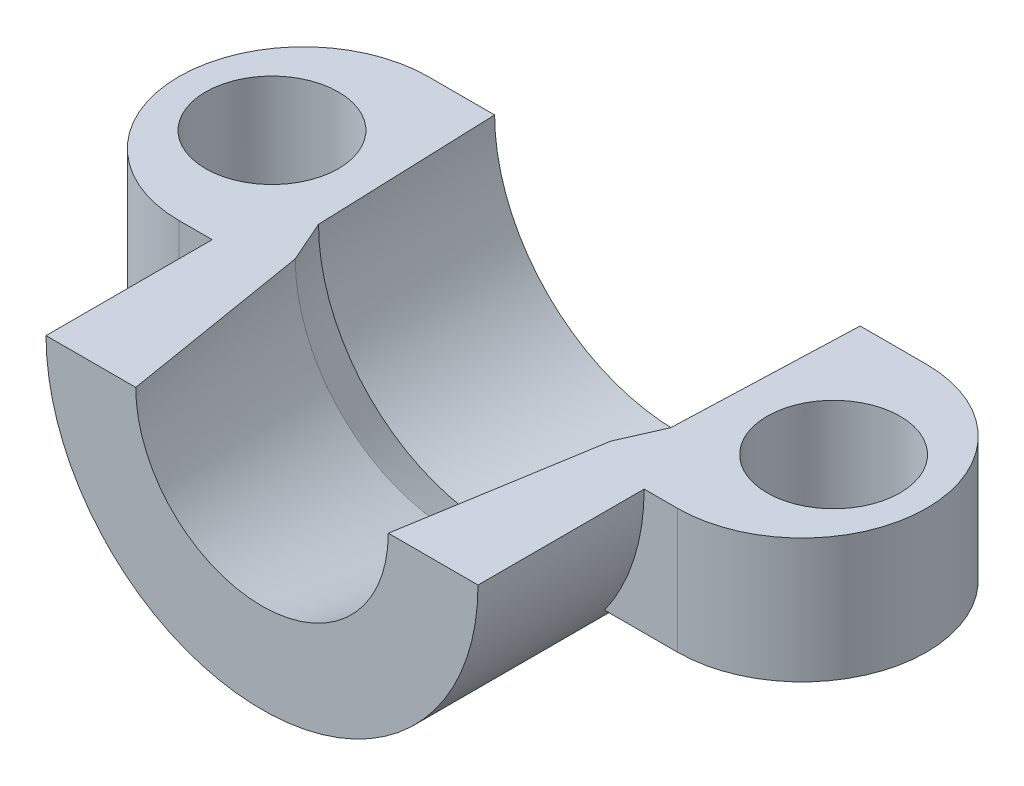
ISO-10303-21;
HEADER;
FILE_DESCRIPTION(('STEP AP214'),'2;1');
FILE_NAME('part.step','',(''),(''),'','','');
FILE_SCHEMA(('AUTOMOTIVE_DESIGN { 1 0 10303 214 1 1 1 1 }'));
ENDSEC;
DATA;
#1=APPLICATION_CONTEXT('core data for automotive mechanical design processes');
#2=APPLICATION_PROTOCOL_DEFINITION('international standard','automotive_design',2000,#1);
#3=PRODUCT_CONTEXT('',#1,'mechanical');
#4=PRODUCT('Part','Part','',(#3));
#5=PRODUCT_RELATED_PRODUCT_CATEGORY('part','',(#4));
#6=PRODUCT_DEFINITION_FORMATION('','',#4);
#7=PRODUCT_DEFINITION_CONTEXT('part definition',#1,'design');
#8=PRODUCT_DEFINITION('design','',#6,#7);
#9=PRODUCT_DEFINITION_SHAPE('','',#8);
#10=(LENGTH_UNIT() NAMED_UNIT(*) SI_UNIT(.MILLI.,.METRE.));
#11=(NAMED_UNIT(*) PLANE_ANGLE_UNIT() SI_UNIT($,.RADIAN.));
#12=(NAMED_UNIT(*) SI_UNIT($,.STERADIAN.) SOLID_ANGLE_UNIT());
#13=UNCERTAINTY_MEASURE_WITH_UNIT(LENGTH_MEASURE(1.E-05),#10,'distance_accuracy_value','');
#14=(GEOMETRIC_REPRESENTATION_CONTEXT(3) GLOBAL_UNCERTAINTY_ASSIGNED_CONTEXT((#13)) GLOBAL_UNIT_ASSIGNED_CONTEXT((#10,
#11,#12)) REPRESENTATION_CONTEXT('',''));
#15=CARTESIAN_POINT('',(0.,0.,0.));
#16=DIRECTION('',(0.,0.,1.));
#17=DIRECTION('',(1.,0.,0.));
#18=AXIS2_PLACEMENT_3D('',#15,#16,#17);
#19=CARTESIAN_POINT('',(0.,0.,-25.));
#20=DIRECTION('',(0.,0.,1.));
#21=DIRECTION('',(1.,0.,0.));
#22=AXIS2_PLACEMENT_3D('',#19,#20,#21);
#23=CYLINDRICAL_SURFACE('',#22,13.);
#24=CARTESIAN_POINT('',(0.,0.,0.));
#25=DIRECTION('',(0.,0.,1.));
#26=DIRECTION('',(1.,0.,0.));
#27=AXIS2_PLACEMENT_3D('',#24,#25,#26);
#28=CIRCLE('',#27,13.);
#29=CARTESIAN_POINT('',(-13.,0.,0.));
#30=VERTEX_POINT('',#29);
#31=CARTESIAN_POINT('',(13.,0.,0.));
#32=VERTEX_POINT('',#31);
#33=EDGE_CURVE('E181',#30,#32,#28,.T.);
#34=ORIENTED_EDGE('',*,*,#33,.F.);
#35=DIRECTION('',(0.,0.,1.));
#36=VECTOR('',#35,1.);
#37=CARTESIAN_POINT('',(-13.,0.,-25.));
#38=LINE('',#37,#36);
#39=CARTESIAN_POINT('',(-13.,0.,-10.));
#40=VERTEX_POINT('',#39);
#41=EDGE_CURVE('E230',#30,#40,#38,.F.);
#42=ORIENTED_EDGE('',*,*,#41,.T.);
#43=CARTESIAN_POINT('',(0.,0.,-10.));
#44=DIRECTION('',(0.,0.,-1.));
#45=DIRECTION('',(-1.,0.,0.));
#46=AXIS2_PLACEMENT_3D('',#43,#44,#45);
#47=CIRCLE('',#46,13.);
#48=CARTESIAN_POINT('',(-10.6183802907976,-7.5,-10.));
#49=VERTEX_POINT('',#48);
#50=EDGE_CURVE('E11',#40,#49,#47,.F.);
#51=ORIENTED_EDGE('',*,*,#50,.T.);
#52=DIRECTION('',(0.,0.,1.));
#53=VECTOR('',#52,1.);
#54=CARTESIAN_POINT('',(-10.6183802907976,-7.5,-25.));
#55=LINE('',#54,#53);
#56=CARTESIAN_POINT('',(-10.6183802907976,-7.5,-25.));
#57=VERTEX_POINT('',#56);
#58=EDGE_CURVE('E148',#57,#49,#55,.T.);
#59=ORIENTED_EDGE('',*,*,#58,.F.);
#60=CARTESIAN_POINT('',(0.,0.,-25.));
#61=DIRECTION('',(0.,0.,1.));
#62=DIRECTION('',(1.,0.,0.));
#63=AXIS2_PLACEMENT_3D('',#60,#61,#62);
#64=CIRCLE('',#63,13.);
#65=CARTESIAN_POINT('',(10.6183802907976,-7.5,-25.));
#66=VERTEX_POINT('',#65);
#67=EDGE_CURVE('E182',#57,#66,#64,.T.);
#68=ORIENTED_EDGE('',*,*,#67,.T.);
#69=DIRECTION('',(0.,0.,1.));
#70=VECTOR('',#69,1.);
#71=CARTESIAN_POINT('',(10.6183802907976,-7.5,-25.));
#72=LINE('',#71,#70);
#73=CARTESIAN_POINT('',(10.6183802907976,-7.5,-10.));
#74=VERTEX_POINT('',#73);
#75=EDGE_CURVE('E164',#74,#66,#72,.F.);
#76=ORIENTED_EDGE('',*,*,#75,.F.);
#77=CARTESIAN_POINT('',(0.,0.,-10.));
#78=DIRECTION('',(0.,0.,-1.));
#79=DIRECTION('',(-1.,0.,0.));
#80=AXIS2_PLACEMENT_3D('',#77,#78,#79);
#81=CIRCLE('',#80,13.);
#82=CARTESIAN_POINT('',(13.,0.,-10.));
#83=VERTEX_POINT('',#82);
#84=EDGE_CURVE('E39',#74,#83,#81,.F.);
#85=ORIENTED_EDGE('',*,*,#84,.T.);
#86=DIRECTION('',(0.,0.,1.));
#87=VECTOR('',#86,1.);
#88=CARTESIAN_POINT('',(13.,0.,-25.));
#89=LINE('',#88,#87);
#90=EDGE_CURVE('E190',#83,#32,#89,.T.);
#91=ORIENTED_EDGE('',*,*,#90,.T.);
#92=EDGE_LOOP('',(#34,#42,#51,#59,#68,#76,#85,#91));
#93=FACE_BOUND('',#92,.T.);
#94=ADVANCED_FACE('F32',(#93),#23,.T.);
#95=CARTESIAN_POINT('',(0.,0.,-25.));
#96=DIRECTION('',(0.,0.,1.));
#97=DIRECTION('',(1.,0.,0.));
#98=AXIS2_PLACEMENT_3D('',#95,#96,#97);
#99=PLANE('',#98);
#100=DIRECTION('',(-1.,0.,0.));
#101=VECTOR('',#100,1.);
#102=CARTESIAN_POINT('',(0.,0.,-25.));
#103=LINE('',#102,#101);
#104=CARTESIAN_POINT('',(15.,0.,-25.));
#105=VERTEX_POINT('',#104);
#106=CARTESIAN_POINT('',(11.,0.,-25.));
#107=VERTEX_POINT('',#106);
#108=EDGE_CURVE('E196',#105,#107,#103,.T.);
#109=ORIENTED_EDGE('',*,*,#108,.F.);
#110=DIRECTION('',(0.,-1.,0.));
#111=VECTOR('',#110,1.);
#112=CARTESIAN_POINT('',(15.,7.5,-25.));
#113=LINE('',#112,#111);
#114=CARTESIAN_POINT('',(15.,-7.5,-25.));
#115=VERTEX_POINT('',#114);
#116=EDGE_CURVE('E158',#105,#115,#113,.T.);
#117=ORIENTED_EDGE('',*,*,#116,.T.);
#118=DIRECTION('',(-1.,0.,0.));
#119=VECTOR('',#118,1.);
#120=CARTESIAN_POINT('',(13.,-7.5,-25.));
#121=LINE('',#120,#119);
#122=EDGE_CURVE('E160',#115,#66,#121,.T.);
#123=ORIENTED_EDGE('',*,*,#122,.T.);
#124=ORIENTED_EDGE('',*,*,#67,.F.);
#125=DIRECTION('',(-1.,0.,0.));
#126=VECTOR('',#125,1.);
#127=CARTESIAN_POINT('',(-13.,-7.5,-25.));
#128=LINE('',#127,#126);
#129=CARTESIAN_POINT('',(-15.,-7.5,-25.));
#130=VERTEX_POINT('',#129);
#131=EDGE_CURVE('E140',#57,#130,#128,.T.);
#132=ORIENTED_EDGE('',*,*,#131,.T.);
#133=DIRECTION('',(0.,-1.,0.));
#134=VECTOR('',#133,1.);
#135=CARTESIAN_POINT('',(-15.,7.5,-25.));
#136=LINE('',#135,#134);
#137=CARTESIAN_POINT('',(-15.,0.,-25.));
#138=VERTEX_POINT('',#137);
#139=EDGE_CURVE('E138',#138,#130,#136,.T.);
#140=ORIENTED_EDGE('',*,*,#139,.F.);
#141=CARTESIAN_POINT('',(-11.,0.,-25.));
#142=VERTEX_POINT('',#141);
#143=EDGE_CURVE('E54',#142,#138,#103,.T.);
#144=ORIENTED_EDGE('',*,*,#143,.F.);
#145=CARTESIAN_POINT('',(0.,0.,-25.));
#146=DIRECTION('',(0.,0.,-1.));
#147=DIRECTION('',(-1.,0.,0.));
#148=AXIS2_PLACEMENT_3D('',#145,#146,#147);
#149=CIRCLE('',#148,11.);
#150=EDGE_CURVE('E169',#107,#142,#149,.T.);
#151=ORIENTED_EDGE('',*,*,#150,.F.);
#152=EDGE_LOOP('',(#109,#117,#123,#124,#132,#140,#144,#151));
#153=FACE_BOUND('',#152,.T.);
#154=ADVANCED_FACE('F254',(#153),#99,.F.);
#155=CARTESIAN_POINT('',(0.,0.,0.));
#156=DIRECTION('',(0.,0.,1.));
#157=DIRECTION('',(1.,0.,0.));
#158=AXIS2_PLACEMENT_3D('',#155,#156,#157);
#159=PLANE('',#158);
#160=ORIENTED_EDGE('',*,*,#33,.T.);
#161=DIRECTION('',(-1.,0.,0.));
#162=VECTOR('',#161,1.);
#163=CARTESIAN_POINT('',(0.,0.,0.));
#164=LINE('',#163,#162);
#165=CARTESIAN_POINT('',(7.6,0.,0.));
#166=VERTEX_POINT('',#165);
#167=EDGE_CURVE('E211',#32,#166,#164,.T.);
#168=ORIENTED_EDGE('',*,*,#167,.T.);
#169=CARTESIAN_POINT('',(0.,0.,0.));
#170=DIRECTION('',(0.,0.,-1.));
#171=DIRECTION('',(-1.,0.,0.));
#172=AXIS2_PLACEMENT_3D('',#169,#170,#171);
#173=CIRCLE('',#172,7.6);
#174=CARTESIAN_POINT('',(-7.6,0.,0.));
#175=VERTEX_POINT('',#174);
#176=EDGE_CURVE('E178',#166,#175,#173,.T.);
#177=ORIENTED_EDGE('',*,*,#176,.T.);
#178=EDGE_CURVE('E200',#175,#30,#164,.T.);
#179=ORIENTED_EDGE('',*,*,#178,.T.);
#180=EDGE_LOOP('',(#160,#168,#177,#179));
#181=FACE_BOUND('',#180,.T.);
#182=ADVANCED_FACE('F258',(#181),#159,.T.);
#183=CARTESIAN_POINT('',(0.,0.,-11.5));
#184=DIRECTION('',(0.,0.,-1.));
#185=DIRECTION('',(-1.,0.,0.));
#186=AXIS2_PLACEMENT_3D('',#183,#184,#185);
#187=CONICAL_SURFACE('',#186,9.5,0.163738241114359);
#188=DIRECTION('',(0.163007578448158,0.,-0.986624816923063));
#189=VECTOR('',#188,1.);
#190=CARTESIAN_POINT('',(0.,0.,46.0000000000001));
#191=LINE('',#190,#189);
#192=CARTESIAN_POINT('',(9.5,0.,-11.5));
#193=VERTEX_POINT('',#192);
#194=EDGE_CURVE('E209',#193,#166,#191,.F.);
#195=ORIENTED_EDGE('',*,*,#194,.F.);
#196=CARTESIAN_POINT('',(0.,0.,-11.5));
#197=DIRECTION('',(0.,0.,-1.));
#198=DIRECTION('',(-1.,0.,0.));
#199=AXIS2_PLACEMENT_3D('',#196,#197,#198);
#200=CIRCLE('',#199,9.5);
#201=CARTESIAN_POINT('',(-9.5,0.,-11.5));
#202=VERTEX_POINT('',#201);
#203=EDGE_CURVE('E175',#193,#202,#200,.T.);
#204=ORIENTED_EDGE('',*,*,#203,.T.);
#205=DIRECTION('',(0.163007578448158,0.,0.986624816923063));
#206=VECTOR('',#205,1.);
#207=CARTESIAN_POINT('',(0.,0.,46.0000000000001));
#208=LINE('',#207,#206);
#209=EDGE_CURVE('E222',#175,#202,#208,.F.);
#210=ORIENTED_EDGE('',*,*,#209,.F.);
#211=ORIENTED_EDGE('',*,*,#176,.F.);
#212=EDGE_LOOP('',(#195,#204,#210,#211));
#213=FACE_BOUND('',#212,.T.);
#214=ADVANCED_FACE('F264',(#213),#187,.F.);
#215=CARTESIAN_POINT('',(0.,0.,-14.));
#216=DIRECTION('',(0.,0.,-1.));
#217=DIRECTION('',(-1.,0.,0.));
#218=AXIS2_PLACEMENT_3D('',#215,#216,#217);
#219=CONICAL_SURFACE('',#218,10.6,0.414506874584786);
#220=DIRECTION('',(0.402738614266017,0.,-0.915315032422766));
#221=VECTOR('',#220,1.);
#222=CARTESIAN_POINT('',(0.,0.,10.0909090909091));
#223=LINE('',#222,#221);
#224=CARTESIAN_POINT('',(10.6,0.,-14.));
#225=VERTEX_POINT('',#224);
#226=EDGE_CURVE('E207',#225,#193,#223,.F.);
#227=ORIENTED_EDGE('',*,*,#226,.F.);
#228=CARTESIAN_POINT('',(0.,0.,-14.));
#229=DIRECTION('',(0.,0.,-1.));
#230=DIRECTION('',(-1.,0.,0.));
#231=AXIS2_PLACEMENT_3D('',#228,#229,#230);
#232=CIRCLE('',#231,10.6);
#233=CARTESIAN_POINT('',(-10.6,0.,-14.));
#234=VERTEX_POINT('',#233);
#235=EDGE_CURVE('E172',#225,#234,#232,.T.);
#236=ORIENTED_EDGE('',*,*,#235,.T.);
#237=DIRECTION('',(0.402738614266017,0.,0.915315032422766));
#238=VECTOR('',#237,1.);
#239=CARTESIAN_POINT('',(0.,0.,10.0909090909091));
#240=LINE('',#239,#238);
#241=EDGE_CURVE('E223',#202,#234,#240,.F.);
#242=ORIENTED_EDGE('',*,*,#241,.F.);
#243=ORIENTED_EDGE('',*,*,#203,.F.);
#244=EDGE_LOOP('',(#227,#236,#242,#243));
#245=FACE_BOUND('',#244,.T.);
#246=ADVANCED_FACE('F269',(#245),#219,.F.);
#247=CARTESIAN_POINT('',(0.,0.,-25.));
#248=DIRECTION('',(0.,0.,-1.));
#249=DIRECTION('',(-1.,0.,0.));
#250=AXIS2_PLACEMENT_3D('',#247,#248,#249);
#251=CONICAL_SURFACE('',#250,11.,0.0363476210190208);
#252=DIRECTION('',(0.0363396181071431,0.,-0.999339497946432));
#253=VECTOR('',#252,1.);
#254=CARTESIAN_POINT('',(0.,0.,277.499999999999));
#255=LINE('',#254,#253);
#256=EDGE_CURVE('E205',#107,#225,#255,.F.);
#257=ORIENTED_EDGE('',*,*,#256,.F.);
#258=ORIENTED_EDGE('',*,*,#150,.T.);
#259=DIRECTION('',(0.0363396181071431,0.,0.999339497946432));
#260=VECTOR('',#259,1.);
#261=CARTESIAN_POINT('',(0.,0.,277.499999999999));
#262=LINE('',#261,#260);
#263=EDGE_CURVE('E226',#234,#142,#262,.F.);
#264=ORIENTED_EDGE('',*,*,#263,.F.);
#265=ORIENTED_EDGE('',*,*,#235,.F.);
#266=EDGE_LOOP('',(#257,#258,#264,#265));
#267=FACE_BOUND('',#266,.T.);
#268=ADVANCED_FACE('F273',(#267),#251,.F.);
#269=CARTESIAN_POINT('',(0.,0.,-10.));
#270=DIRECTION('',(0.,0.,-1.));
#271=DIRECTION('',(-1.,0.,0.));
#272=AXIS2_PLACEMENT_3D('',#269,#270,#271);
#273=PLANE('',#272);
#274=DIRECTION('',(1.,0.,0.));
#275=VECTOR('',#274,1.);
#276=CARTESIAN_POINT('',(0.,0.,-10.));
#277=LINE('',#276,#275);
#278=CARTESIAN_POINT('',(15.,0.,-10.));
#279=VERTEX_POINT('',#278);
#280=EDGE_CURVE('E46',#83,#279,#277,.T.);
#281=ORIENTED_EDGE('',*,*,#280,.F.);
#282=ORIENTED_EDGE('',*,*,#84,.F.);
#283=DIRECTION('',(-1.,0.,0.));
#284=VECTOR('',#283,1.);
#285=CARTESIAN_POINT('',(13.,-7.5,-10.));
#286=LINE('',#285,#284);
#287=CARTESIAN_POINT('',(15.,-7.5,-10.));
#288=VERTEX_POINT('',#287);
#289=EDGE_CURVE('E161',#288,#74,#286,.T.);
#290=ORIENTED_EDGE('',*,*,#289,.F.);
#291=DIRECTION('',(0.,-1.,0.));
#292=VECTOR('',#291,1.);
#293=CARTESIAN_POINT('',(15.,7.5,-10.));
#294=LINE('',#293,#292);
#295=EDGE_CURVE('E156',#279,#288,#294,.T.);
#296=ORIENTED_EDGE('',*,*,#295,.F.);
#297=EDGE_LOOP('',(#281,#282,#290,#296));
#298=FACE_BOUND('',#297,.T.);
#299=ADVANCED_FACE('F193',(#298),#273,.F.);
#300=CARTESIAN_POINT('',(15.,7.5,-17.5));
#301=DIRECTION('',(0.,-1.,0.));
#302=DIRECTION('',(0.,0.,-1.));
#303=AXIS2_PLACEMENT_3D('',#300,#301,#302);
#304=CYLINDRICAL_SURFACE('',#303,7.5);
#305=CARTESIAN_POINT('',(15.,0.,-17.5));
#306=DIRECTION('',(0.,1.,0.));
#307=DIRECTION('',(0.,0.,1.));
#308=AXIS2_PLACEMENT_3D('',#305,#306,#307);
#309=CIRCLE('',#308,7.5);
#310=EDGE_CURVE('E197',#279,#105,#309,.T.);
#311=ORIENTED_EDGE('',*,*,#310,.F.);
#312=ORIENTED_EDGE('',*,*,#295,.T.);
#313=CARTESIAN_POINT('',(15.,-7.5,-17.5));
#314=DIRECTION('',(0.,1.,0.));
#315=DIRECTION('',(0.,0.,1.));
#316=AXIS2_PLACEMENT_3D('',#313,#314,#315);
#317=CIRCLE('',#316,7.5);
#318=EDGE_CURVE('E153',#288,#115,#317,.T.);
#319=ORIENTED_EDGE('',*,*,#318,.T.);
#320=ORIENTED_EDGE('',*,*,#116,.F.);
#321=EDGE_LOOP('',(#311,#312,#319,#320));
#322=FACE_BOUND('',#321,.T.);
#323=ADVANCED_FACE('F284',(#322),#304,.T.);
#324=CARTESIAN_POINT('',(0.,0.,-10.));
#325=DIRECTION('',(0.,0.,-1.));
#326=DIRECTION('',(-1.,0.,0.));
#327=AXIS2_PLACEMENT_3D('',#324,#325,#326);
#328=PLANE('',#327);
#329=DIRECTION('',(1.,0.,0.));
#330=VECTOR('',#329,1.);
#331=CARTESIAN_POINT('',(0.,0.,-10.));
#332=LINE('',#331,#330);
#333=CARTESIAN_POINT('',(-15.,0.,-10.));
#334=VERTEX_POINT('',#333);
#335=EDGE_CURVE('E120',#334,#40,#332,.T.);
#336=ORIENTED_EDGE('',*,*,#335,.F.);
#337=DIRECTION('',(0.,-1.,0.));
#338=VECTOR('',#337,1.);
#339=CARTESIAN_POINT('',(-15.,7.5,-10.));
#340=LINE('',#339,#338);
#341=CARTESIAN_POINT('',(-15.,-7.5,-10.));
#342=VERTEX_POINT('',#341);
#343=EDGE_CURVE('E131',#334,#342,#340,.T.);
#344=ORIENTED_EDGE('',*,*,#343,.T.);
#345=DIRECTION('',(-1.,0.,0.));
#346=VECTOR('',#345,1.);
#347=CARTESIAN_POINT('',(-13.,-7.5,-10.));
#348=LINE('',#347,#346);
#349=EDGE_CURVE('E146',#49,#342,#348,.T.);
#350=ORIENTED_EDGE('',*,*,#349,.F.);
#351=ORIENTED_EDGE('',*,*,#50,.F.);
#352=EDGE_LOOP('',(#336,#344,#350,#351));
#353=FACE_BOUND('',#352,.T.);
#354=ADVANCED_FACE('F129',(#353),#328,.F.);
#355=CARTESIAN_POINT('',(-15.,7.5,-17.5));
#356=DIRECTION('',(0.,-1.,0.));
#357=DIRECTION('',(0.,0.,-1.));
#358=AXIS2_PLACEMENT_3D('',#355,#356,#357);
#359=CYLINDRICAL_SURFACE('',#358,7.5);
#360=CARTESIAN_POINT('',(-15.,0.,-17.5));
#361=DIRECTION('',(0.,1.,0.));
#362=DIRECTION('',(0.,0.,1.));
#363=AXIS2_PLACEMENT_3D('',#360,#361,#362);
#364=CIRCLE('',#363,7.5);
#365=EDGE_CURVE('E116',#138,#334,#364,.T.);
#366=ORIENTED_EDGE('',*,*,#365,.F.);
#367=ORIENTED_EDGE('',*,*,#139,.T.);
#368=CARTESIAN_POINT('',(-15.,-7.5,-17.5));
#369=DIRECTION('',(0.,1.,0.));
#370=DIRECTION('',(0.,0.,-1.));
#371=AXIS2_PLACEMENT_3D('',#368,#369,#370);
#372=CIRCLE('',#371,7.5);
#373=EDGE_CURVE('E137',#130,#342,#372,.T.);
#374=ORIENTED_EDGE('',*,*,#373,.T.);
#375=ORIENTED_EDGE('',*,*,#343,.F.);
#376=EDGE_LOOP('',(#366,#367,#374,#375));
#377=FACE_BOUND('',#376,.T.);
#378=ADVANCED_FACE('F135',(#377),#359,.T.);
#379=CARTESIAN_POINT('',(13.,-7.5,-10.));
#380=DIRECTION('',(0.,-1.,0.));
#381=DIRECTION('',(0.,0.,-1.));
#382=AXIS2_PLACEMENT_3D('',#379,#380,#381);
#383=PLANE('',#382);
#384=CARTESIAN_POINT('',(16.9,-7.5,-17.5));
#385=DIRECTION('',(0.,-1.,0.));
#386=DIRECTION('',(0.,0.,-1.));
#387=AXIS2_PLACEMENT_3D('',#384,#385,#386);
#388=CIRCLE('',#387,4.);
#389=CARTESIAN_POINT('',(16.9,-7.5,-21.5));
#390=VERTEX_POINT('',#389);
#391=EDGE_CURVE('E213',#390,#390,#388,.T.);
#392=ORIENTED_EDGE('',*,*,#391,.F.);
#393=EDGE_LOOP('',(#392));
#394=FACE_BOUND('',#393,.T.);
#395=ORIENTED_EDGE('',*,*,#289,.T.);
#396=ORIENTED_EDGE('',*,*,#75,.T.);
#397=ORIENTED_EDGE('',*,*,#122,.F.);
#398=ORIENTED_EDGE('',*,*,#318,.F.);
#399=EDGE_LOOP('',(#395,#396,#397,#398));
#400=FACE_BOUND('',#399,.T.);
#401=ADVANCED_FACE('F278',(#394,#400),#383,.T.);
#402=CARTESIAN_POINT('',(-13.,-7.5,-10.));
#403=DIRECTION('',(0.,-1.,0.));
#404=DIRECTION('',(0.,0.,-1.));
#405=AXIS2_PLACEMENT_3D('',#402,#403,#404);
#406=PLANE('',#405);
#407=CARTESIAN_POINT('',(-16.9,-7.5,-17.5));
#408=DIRECTION('',(0.,-1.,0.));
#409=DIRECTION('',(0.,0.,-1.));
#410=AXIS2_PLACEMENT_3D('',#407,#408,#409);
#411=CIRCLE('',#410,4.);
#412=CARTESIAN_POINT('',(-16.9,-7.5,-21.5));
#413=VERTEX_POINT('',#412);
#414=EDGE_CURVE('E142',#413,#413,#411,.T.);
#415=ORIENTED_EDGE('',*,*,#414,.F.);
#416=EDGE_LOOP('',(#415));
#417=FACE_BOUND('',#416,.T.);
#418=ORIENTED_EDGE('',*,*,#131,.F.);
#419=ORIENTED_EDGE('',*,*,#58,.T.);
#420=ORIENTED_EDGE('',*,*,#349,.T.);
#421=ORIENTED_EDGE('',*,*,#373,.F.);
#422=EDGE_LOOP('',(#418,#419,#420,#421));
#423=FACE_BOUND('',#422,.T.);
#424=ADVANCED_FACE('F249',(#417,#423),#406,.T.);
#425=CARTESIAN_POINT('',(-16.9,0.,-17.5));
#426=DIRECTION('',(0.,-1.,0.));
#427=DIRECTION('',(0.,0.,-1.));
#428=AXIS2_PLACEMENT_3D('',#425,#426,#427);
#429=CYLINDRICAL_SURFACE('',#428,4.);
#430=CARTESIAN_POINT('',(-16.9,0.,-17.5));
#431=DIRECTION('',(0.,1.,0.));
#432=DIRECTION('',(0.,0.,1.));
#433=AXIS2_PLACEMENT_3D('',#430,#431,#432);
#434=CIRCLE('',#433,4.);
#435=CARTESIAN_POINT('',(-16.9,0.,-13.5));
#436=VERTEX_POINT('',#435);
#437=EDGE_CURVE('E125',#436,#436,#434,.F.);
#438=ORIENTED_EDGE('',*,*,#437,.F.);
#439=EDGE_LOOP('',(#438));
#440=FACE_BOUND('',#439,.T.);
#441=ORIENTED_EDGE('',*,*,#414,.T.);
#442=EDGE_LOOP('',(#441));
#443=FACE_BOUND('',#442,.T.);
#444=ADVANCED_FACE('F242',(#440,#443),#429,.F.);
#445=CARTESIAN_POINT('',(16.9,0.,-17.5));
#446=DIRECTION('',(0.,-1.,0.));
#447=DIRECTION('',(0.,0.,-1.));
#448=AXIS2_PLACEMENT_3D('',#445,#446,#447);
#449=CYLINDRICAL_SURFACE('',#448,4.);
#450=CARTESIAN_POINT('',(16.9,0.,-17.5));
#451=DIRECTION('',(0.,1.,0.));
#452=DIRECTION('',(0.,0.,1.));
#453=AXIS2_PLACEMENT_3D('',#450,#451,#452);
#454=CIRCLE('',#453,4.);
#455=CARTESIAN_POINT('',(16.9,0.,-13.5));
#456=VERTEX_POINT('',#455);
#457=EDGE_CURVE('E234',#456,#456,#454,.F.);
#458=ORIENTED_EDGE('',*,*,#457,.F.);
#459=EDGE_LOOP('',(#458));
#460=FACE_BOUND('',#459,.T.);
#461=ORIENTED_EDGE('',*,*,#391,.T.);
#462=EDGE_LOOP('',(#461));
#463=FACE_BOUND('',#462,.T.);
#464=ADVANCED_FACE('F240',(#460,#463),#449,.F.);
#465=CARTESIAN_POINT('',(0.,0.,0.));
#466=DIRECTION('',(0.,1.,0.));
#467=DIRECTION('',(0.,0.,1.));
#468=AXIS2_PLACEMENT_3D('',#465,#466,#467);
#469=PLANE('',#468);
#470=ORIENTED_EDGE('',*,*,#90,.F.);
#471=ORIENTED_EDGE('',*,*,#280,.T.);
#472=ORIENTED_EDGE('',*,*,#310,.T.);
#473=ORIENTED_EDGE('',*,*,#108,.T.);
#474=ORIENTED_EDGE('',*,*,#256,.T.);
#475=ORIENTED_EDGE('',*,*,#226,.T.);
#476=ORIENTED_EDGE('',*,*,#194,.T.);
#477=ORIENTED_EDGE('',*,*,#167,.F.);
#478=EDGE_LOOP('',(#470,#471,#472,#473,#474,#475,#476,#477));
#479=FACE_BOUND('',#478,.T.);
#480=ORIENTED_EDGE('',*,*,#457,.T.);
#481=EDGE_LOOP('',(#480));
#482=FACE_BOUND('',#481,.T.);
#483=ADVANCED_FACE('F238',(#479,#482),#469,.T.);
#484=ORIENTED_EDGE('',*,*,#209,.T.);
#485=ORIENTED_EDGE('',*,*,#241,.T.);
#486=ORIENTED_EDGE('',*,*,#263,.T.);
#487=ORIENTED_EDGE('',*,*,#143,.T.);
#488=ORIENTED_EDGE('',*,*,#365,.T.);
#489=ORIENTED_EDGE('',*,*,#335,.T.);
#490=ORIENTED_EDGE('',*,*,#41,.F.);
#491=ORIENTED_EDGE('',*,*,#178,.F.);
#492=EDGE_LOOP('',(#484,#485,#486,#487,#488,#489,#490,#491));
#493=FACE_BOUND('',#492,.T.);
#494=ORIENTED_EDGE('',*,*,#437,.T.);
#495=EDGE_LOOP('',(#494));
#496=FACE_BOUND('',#495,.T.);
#497=ADVANCED_FACE('F118',(#493,#496),#469,.T.);
#498=CLOSED_SHELL('',(#94,#154,#182,#214,#246,#268,#299,#323,#354,#378,#401,#424,#444,#464,#483,#497));
#499=MANIFOLD_SOLID_BREP('B2',#498);
#500=ADVANCED_BREP_SHAPE_REPRESENTATION('',(#18,#499),#14);
#501=SHAPE_DEFINITION_REPRESENTATION(#9,#500);
ENDSEC;
END-ISO-10303-21;
